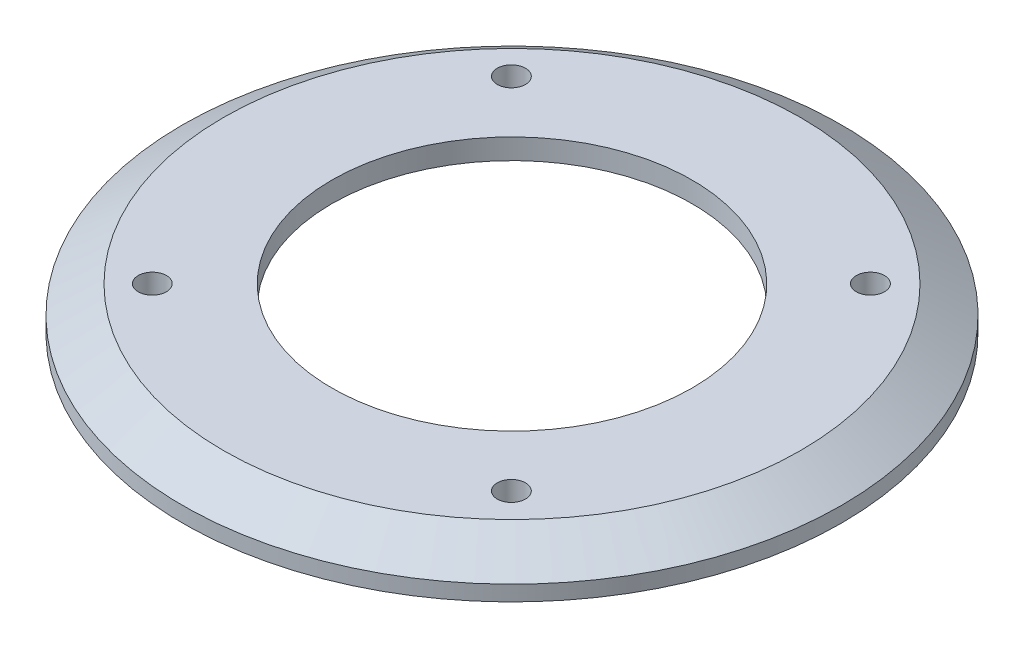
ISO-10303-21;
HEADER;
FILE_DESCRIPTION(('STEP AP214'),'2;1');
FILE_NAME('part.step','',(''),(''),'','','');
FILE_SCHEMA(('AUTOMOTIVE_DESIGN { 1 0 10303 214 1 1 1 1 }'));
ENDSEC;
DATA;
#1=APPLICATION_CONTEXT('core data for automotive mechanical design processes');
#2=APPLICATION_PROTOCOL_DEFINITION('international standard','automotive_design',2000,#1);
#3=PRODUCT_CONTEXT('',#1,'mechanical');
#4=PRODUCT('Part','Part','',(#3));
#5=PRODUCT_RELATED_PRODUCT_CATEGORY('part','',(#4));
#6=PRODUCT_DEFINITION_FORMATION('','',#4);
#7=PRODUCT_DEFINITION_CONTEXT('part definition',#1,'design');
#8=PRODUCT_DEFINITION('design','',#6,#7);
#9=PRODUCT_DEFINITION_SHAPE('','',#8);
#10=(LENGTH_UNIT() NAMED_UNIT(*) SI_UNIT(.MILLI.,.METRE.));
#11=(NAMED_UNIT(*) PLANE_ANGLE_UNIT() SI_UNIT($,.RADIAN.));
#12=(NAMED_UNIT(*) SI_UNIT($,.STERADIAN.) SOLID_ANGLE_UNIT());
#13=UNCERTAINTY_MEASURE_WITH_UNIT(LENGTH_MEASURE(1.E-05),#10,'distance_accuracy_value','');
#14=(GEOMETRIC_REPRESENTATION_CONTEXT(3) GLOBAL_UNCERTAINTY_ASSIGNED_CONTEXT((#13)) GLOBAL_UNIT_ASSIGNED_CONTEXT((#10,
#11,#12)) REPRESENTATION_CONTEXT('',''));
#15=CARTESIAN_POINT('',(0.,0.,0.));
#16=DIRECTION('',(0.,0.,1.));
#17=DIRECTION('',(1.,0.,0.));
#18=AXIS2_PLACEMENT_3D('',#15,#16,#17);
#19=CARTESIAN_POINT('',(-14.7227452919764,34.4112676056337,0.));
#20=DIRECTION('',(0.,1.,0.));
#21=DIRECTION('',(-1.,0.,0.));
#22=AXIS2_PLACEMENT_3D('',#19,#20,#21);
#23=CYLINDRICAL_SURFACE('',#22,70.25);
#24=CARTESIAN_POINT('',(-14.7227452919764,-8.78873239436612,0.));
#25=DIRECTION('',(0.,1.,0.));
#26=DIRECTION('',(-1.,0.,0.));
#27=AXIS2_PLACEMENT_3D('',#24,#25,#26);
#28=CIRCLE('',#27,70.25);
#29=CARTESIAN_POINT('',(-84.9727452919764,-8.78873239436613,0.));
#30=VERTEX_POINT('',#29);
#31=EDGE_CURVE('E10',#30,#30,#28,.T.);
#32=ORIENTED_EDGE('',*,*,#31,.T.);
#33=EDGE_LOOP('',(#32));
#34=FACE_BOUND('',#33,.T.);
#35=CARTESIAN_POINT('',(-14.7227452919764,-16.7887323943661,0.));
#36=DIRECTION('',(0.,1.,0.));
#37=DIRECTION('',(-1.,0.,0.));
#38=AXIS2_PLACEMENT_3D('',#35,#36,#37);
#39=CIRCLE('',#38,70.25);
#40=CARTESIAN_POINT('',(-84.9727452919764,-16.7887323943661,0.));
#41=VERTEX_POINT('',#40);
#42=EDGE_CURVE('E55',#41,#41,#39,.T.);
#43=ORIENTED_EDGE('',*,*,#42,.F.);
#44=EDGE_LOOP('',(#43));
#45=FACE_BOUND('',#44,.T.);
#46=ADVANCED_FACE('F30',(#34,#45),#23,.F.);
#47=CARTESIAN_POINT('',(-84.9727452919764,-8.78873239436612,0.));
#48=DIRECTION('',(0.,1.,0.));
#49=DIRECTION('',(-1.,0.,0.));
#50=AXIS2_PLACEMENT_3D('',#47,#48,#49);
#51=PLANE('',#50);
#52=CARTESIAN_POINT('',(-84.9727452919766,-8.78873239436612,-70.));
#53=DIRECTION('',(0.,1.,0.));
#54=DIRECTION('',(-1.,0.,0.));
#55=AXIS2_PLACEMENT_3D('',#52,#53,#54);
#56=CIRCLE('',#55,5.50000000000009);
#57=CARTESIAN_POINT('',(-90.4727452919767,-8.78873239436612,-70.));
#58=VERTEX_POINT('',#57);
#59=EDGE_CURVE('E76',#58,#58,#56,.T.);
#60=ORIENTED_EDGE('',*,*,#59,.F.);
#61=EDGE_LOOP('',(#60));
#62=FACE_BOUND('',#61,.T.);
#63=CARTESIAN_POINT('',(55.0272547080235,-8.78873239436611,-70.));
#64=DIRECTION('',(0.,1.,0.));
#65=DIRECTION('',(-1.,0.,0.));
#66=AXIS2_PLACEMENT_3D('',#63,#64,#65);
#67=CIRCLE('',#66,5.50000000000008);
#68=CARTESIAN_POINT('',(49.5272547080234,-8.78873239436611,-70.));
#69=VERTEX_POINT('',#68);
#70=EDGE_CURVE('E70',#69,#69,#67,.T.);
#71=ORIENTED_EDGE('',*,*,#70,.F.);
#72=EDGE_LOOP('',(#71));
#73=FACE_BOUND('',#72,.T.);
#74=CARTESIAN_POINT('',(55.0272547080235,-8.78873239436611,70.));
#75=DIRECTION('',(0.,1.,0.));
#76=DIRECTION('',(-1.,0.,0.));
#77=AXIS2_PLACEMENT_3D('',#74,#75,#76);
#78=CIRCLE('',#77,5.50000000000006);
#79=CARTESIAN_POINT('',(49.5272547080234,-8.78873239436611,70.));
#80=VERTEX_POINT('',#79);
#81=EDGE_CURVE('E64',#80,#80,#78,.T.);
#82=ORIENTED_EDGE('',*,*,#81,.F.);
#83=EDGE_LOOP('',(#82));
#84=FACE_BOUND('',#83,.T.);
#85=CARTESIAN_POINT('',(-84.9727452919766,-8.78873239436612,70.));
#86=DIRECTION('',(0.,1.,0.));
#87=DIRECTION('',(-1.,0.,0.));
#88=AXIS2_PLACEMENT_3D('',#85,#86,#87);
#89=CIRCLE('',#88,5.50000000000006);
#90=CARTESIAN_POINT('',(-90.4727452919767,-8.78873239436612,70.));
#91=VERTEX_POINT('',#90);
#92=EDGE_CURVE('E58',#91,#91,#89,.T.);
#93=ORIENTED_EDGE('',*,*,#92,.F.);
#94=EDGE_LOOP('',(#93));
#95=FACE_BOUND('',#94,.T.);
#96=CARTESIAN_POINT('',(-14.7227452919764,-8.78873239436612,0.));
#97=DIRECTION('',(0.,1.,0.));
#98=DIRECTION('',(-1.,0.,0.));
#99=AXIS2_PLACEMENT_3D('',#96,#97,#98);
#100=CIRCLE('',#99,112.5);
#101=CARTESIAN_POINT('',(-127.222745291977,-8.78873239436613,0.));
#102=VERTEX_POINT('',#101);
#103=EDGE_CURVE('E36',#102,#102,#100,.T.);
#104=ORIENTED_EDGE('',*,*,#103,.T.);
#105=EDGE_LOOP('',(#104));
#106=FACE_BOUND('',#105,.T.);
#107=ORIENTED_EDGE('',*,*,#31,.F.);
#108=EDGE_LOOP('',(#107));
#109=FACE_BOUND('',#108,.T.);
#110=ADVANCED_FACE('F121',(#62,#73,#84,#95,#106,#109),#51,.T.);
#111=CARTESIAN_POINT('',(-14.7227452919764,-8.78873239436612,0.));
#112=DIRECTION('',(0.,-1.,0.));
#113=DIRECTION('',(1.,0.,0.));
#114=AXIS2_PLACEMENT_3D('',#111,#112,#113);
#115=CONICAL_SURFACE('',#114,112.5,0.990039973227227);
#116=CARTESIAN_POINT('',(-14.7227452919764,-19.2887323943661,0.));
#117=DIRECTION('',(0.,1.,0.));
#118=DIRECTION('',(-1.,0.,0.));
#119=AXIS2_PLACEMENT_3D('',#116,#117,#118);
#120=CIRCLE('',#119,128.5);
#121=CARTESIAN_POINT('',(-143.222745291977,-19.2887323943661,0.));
#122=VERTEX_POINT('',#121);
#123=EDGE_CURVE('E40',#122,#122,#120,.T.);
#124=ORIENTED_EDGE('',*,*,#123,.T.);
#125=EDGE_LOOP('',(#124));
#126=FACE_BOUND('',#125,.T.);
#127=ORIENTED_EDGE('',*,*,#103,.F.);
#128=EDGE_LOOP('',(#127));
#129=FACE_BOUND('',#128,.T.);
#130=ADVANCED_FACE('F115',(#126,#129),#115,.T.);
#131=CARTESIAN_POINT('',(-14.7227452919764,34.4112676056337,0.));
#132=DIRECTION('',(0.,1.,0.));
#133=DIRECTION('',(-1.,0.,0.));
#134=AXIS2_PLACEMENT_3D('',#131,#132,#133);
#135=CYLINDRICAL_SURFACE('',#134,128.5);
#136=CARTESIAN_POINT('',(-14.7227452919764,-25.2887323943661,0.));
#137=DIRECTION('',(0.,1.,0.));
#138=DIRECTION('',(-1.,0.,0.));
#139=AXIS2_PLACEMENT_3D('',#136,#137,#138);
#140=CIRCLE('',#139,128.5);
#141=CARTESIAN_POINT('',(-143.222745291977,-25.2887323943661,0.));
#142=VERTEX_POINT('',#141);
#143=EDGE_CURVE('E44',#142,#142,#140,.T.);
#144=ORIENTED_EDGE('',*,*,#143,.T.);
#145=EDGE_LOOP('',(#144));
#146=FACE_BOUND('',#145,.T.);
#147=ORIENTED_EDGE('',*,*,#123,.F.);
#148=EDGE_LOOP('',(#147));
#149=FACE_BOUND('',#148,.T.);
#150=ADVANCED_FACE('F109',(#146,#149),#135,.T.);
#151=CARTESIAN_POINT('',(-143.222745291977,-25.2887323943661,0.));
#152=DIRECTION('',(0.,-1.,0.));
#153=DIRECTION('',(1.,0.,0.));
#154=AXIS2_PLACEMENT_3D('',#151,#152,#153);
#155=PLANE('',#154);
#156=CARTESIAN_POINT('',(-14.7227452919764,-25.2887323943661,0.));
#157=DIRECTION('',(0.,1.,0.));
#158=DIRECTION('',(-1.,0.,0.));
#159=AXIS2_PLACEMENT_3D('',#156,#157,#158);
#160=CIRCLE('',#159,113.5);
#161=CARTESIAN_POINT('',(-128.222745291976,-25.2887323943661,0.));
#162=VERTEX_POINT('',#161);
#163=EDGE_CURVE('E49',#162,#162,#160,.T.);
#164=ORIENTED_EDGE('',*,*,#163,.T.);
#165=EDGE_LOOP('',(#164));
#166=FACE_BOUND('',#165,.T.);
#167=ORIENTED_EDGE('',*,*,#143,.F.);
#168=EDGE_LOOP('',(#167));
#169=FACE_BOUND('',#168,.T.);
#170=ADVANCED_FACE('F103',(#166,#169),#155,.T.);
#171=CARTESIAN_POINT('',(-14.7227452919764,34.4112676056337,0.));
#172=DIRECTION('',(0.,1.,0.));
#173=DIRECTION('',(-1.,0.,0.));
#174=AXIS2_PLACEMENT_3D('',#171,#172,#173);
#175=CYLINDRICAL_SURFACE('',#174,113.5);
#176=CARTESIAN_POINT('',(-14.7227452919764,-16.7887323943661,0.));
#177=DIRECTION('',(0.,1.,0.));
#178=DIRECTION('',(-1.,0.,0.));
#179=AXIS2_PLACEMENT_3D('',#176,#177,#178);
#180=CIRCLE('',#179,113.5);
#181=CARTESIAN_POINT('',(-128.222745291976,-16.7887323943661,0.));
#182=VERTEX_POINT('',#181);
#183=EDGE_CURVE('E52',#182,#182,#180,.T.);
#184=ORIENTED_EDGE('',*,*,#183,.T.);
#185=EDGE_LOOP('',(#184));
#186=FACE_BOUND('',#185,.T.);
#187=ORIENTED_EDGE('',*,*,#163,.F.);
#188=EDGE_LOOP('',(#187));
#189=FACE_BOUND('',#188,.T.);
#190=ADVANCED_FACE('F89',(#186,#189),#175,.F.);
#191=CARTESIAN_POINT('',(-128.222745291976,-16.7887323943661,0.));
#192=DIRECTION('',(0.,-1.,0.));
#193=DIRECTION('',(1.,0.,0.));
#194=AXIS2_PLACEMENT_3D('',#191,#192,#193);
#195=PLANE('',#194);
#196=CARTESIAN_POINT('',(-84.9727452919766,-16.7887323943661,-70.));
#197=DIRECTION('',(0.,-1.,0.));
#198=DIRECTION('',(0.,0.,-1.));
#199=AXIS2_PLACEMENT_3D('',#196,#197,#198);
#200=CIRCLE('',#199,5.50000000000009);
#201=CARTESIAN_POINT('',(-84.9727452919766,-16.7887323943661,-75.5000000000001));
#202=VERTEX_POINT('',#201);
#203=EDGE_CURVE('E79',#202,#202,#200,.T.);
#204=ORIENTED_EDGE('',*,*,#203,.F.);
#205=EDGE_LOOP('',(#204));
#206=FACE_BOUND('',#205,.T.);
#207=CARTESIAN_POINT('',(55.0272547080235,-16.7887323943661,-70.));
#208=DIRECTION('',(0.,-1.,0.));
#209=DIRECTION('',(0.,0.,-1.));
#210=AXIS2_PLACEMENT_3D('',#207,#208,#209);
#211=CIRCLE('',#210,5.50000000000008);
#212=CARTESIAN_POINT('',(55.0272547080235,-16.7887323943661,-75.5000000000001));
#213=VERTEX_POINT('',#212);
#214=EDGE_CURVE('E73',#213,#213,#211,.T.);
#215=ORIENTED_EDGE('',*,*,#214,.F.);
#216=EDGE_LOOP('',(#215));
#217=FACE_BOUND('',#216,.T.);
#218=CARTESIAN_POINT('',(55.0272547080235,-16.7887323943661,70.));
#219=DIRECTION('',(0.,-1.,0.));
#220=DIRECTION('',(0.,0.,-1.));
#221=AXIS2_PLACEMENT_3D('',#218,#219,#220);
#222=CIRCLE('',#221,5.50000000000006);
#223=CARTESIAN_POINT('',(55.0272547080235,-16.7887323943661,64.5));
#224=VERTEX_POINT('',#223);
#225=EDGE_CURVE('E67',#224,#224,#222,.T.);
#226=ORIENTED_EDGE('',*,*,#225,.F.);
#227=EDGE_LOOP('',(#226));
#228=FACE_BOUND('',#227,.T.);
#229=CARTESIAN_POINT('',(-84.9727452919766,-16.7887323943661,70.));
#230=DIRECTION('',(0.,-1.,0.));
#231=DIRECTION('',(0.,0.,-1.));
#232=AXIS2_PLACEMENT_3D('',#229,#230,#231);
#233=CIRCLE('',#232,5.50000000000006);
#234=CARTESIAN_POINT('',(-84.9727452919766,-16.7887323943661,64.5));
#235=VERTEX_POINT('',#234);
#236=EDGE_CURVE('E61',#235,#235,#233,.T.);
#237=ORIENTED_EDGE('',*,*,#236,.F.);
#238=EDGE_LOOP('',(#237));
#239=FACE_BOUND('',#238,.T.);
#240=ORIENTED_EDGE('',*,*,#42,.T.);
#241=EDGE_LOOP('',(#240));
#242=FACE_BOUND('',#241,.T.);
#243=ORIENTED_EDGE('',*,*,#183,.F.);
#244=EDGE_LOOP('',(#243));
#245=FACE_BOUND('',#244,.T.);
#246=ADVANCED_FACE('F85',(#206,#217,#228,#239,#242,#245),#195,.T.);
#247=CARTESIAN_POINT('',(-84.9727452919766,-6.78873239436611,70.));
#248=DIRECTION('',(0.,-1.,0.));
#249=DIRECTION('',(0.,0.,-1.));
#250=AXIS2_PLACEMENT_3D('',#247,#248,#249);
#251=CYLINDRICAL_SURFACE('',#250,5.50000000000006);
#252=ORIENTED_EDGE('',*,*,#92,.T.);
#253=EDGE_LOOP('',(#252));
#254=FACE_BOUND('',#253,.T.);
#255=ORIENTED_EDGE('',*,*,#236,.T.);
#256=EDGE_LOOP('',(#255));
#257=FACE_BOUND('',#256,.T.);
#258=ADVANCED_FACE('F88',(#254,#257),#251,.F.);
#259=CARTESIAN_POINT('',(55.0272547080235,-6.78873239436611,70.));
#260=DIRECTION('',(0.,-1.,0.));
#261=DIRECTION('',(0.,0.,-1.));
#262=AXIS2_PLACEMENT_3D('',#259,#260,#261);
#263=CYLINDRICAL_SURFACE('',#262,5.50000000000006);
#264=ORIENTED_EDGE('',*,*,#81,.T.);
#265=EDGE_LOOP('',(#264));
#266=FACE_BOUND('',#265,.T.);
#267=ORIENTED_EDGE('',*,*,#225,.T.);
#268=EDGE_LOOP('',(#267));
#269=FACE_BOUND('',#268,.T.);
#270=ADVANCED_FACE('F155',(#266,#269),#263,.F.);
#271=CARTESIAN_POINT('',(55.0272547080235,-6.78873239436611,-70.));
#272=DIRECTION('',(0.,-1.,0.));
#273=DIRECTION('',(0.,0.,-1.));
#274=AXIS2_PLACEMENT_3D('',#271,#272,#273);
#275=CYLINDRICAL_SURFACE('',#274,5.50000000000008);
#276=ORIENTED_EDGE('',*,*,#70,.T.);
#277=EDGE_LOOP('',(#276));
#278=FACE_BOUND('',#277,.T.);
#279=ORIENTED_EDGE('',*,*,#214,.T.);
#280=EDGE_LOOP('',(#279));
#281=FACE_BOUND('',#280,.T.);
#282=ADVANCED_FACE('F165',(#278,#281),#275,.F.);
#283=CARTESIAN_POINT('',(-84.9727452919766,-6.78873239436611,-70.));
#284=DIRECTION('',(0.,-1.,0.));
#285=DIRECTION('',(0.,0.,-1.));
#286=AXIS2_PLACEMENT_3D('',#283,#284,#285);
#287=CYLINDRICAL_SURFACE('',#286,5.50000000000009);
#288=ORIENTED_EDGE('',*,*,#59,.T.);
#289=EDGE_LOOP('',(#288));
#290=FACE_BOUND('',#289,.T.);
#291=ORIENTED_EDGE('',*,*,#203,.T.);
#292=EDGE_LOOP('',(#291));
#293=FACE_BOUND('',#292,.T.);
#294=ADVANCED_FACE('F83',(#290,#293),#287,.F.);
#295=CLOSED_SHELL('',(#46,#110,#130,#150,#170,#190,#246,#258,#270,#282,#294));
#296=MANIFOLD_SOLID_BREP('B2',#295);
#297=ADVANCED_BREP_SHAPE_REPRESENTATION('',(#18,#296),#14);
#298=SHAPE_DEFINITION_REPRESENTATION(#9,#297);
ENDSEC;
END-ISO-10303-21;
